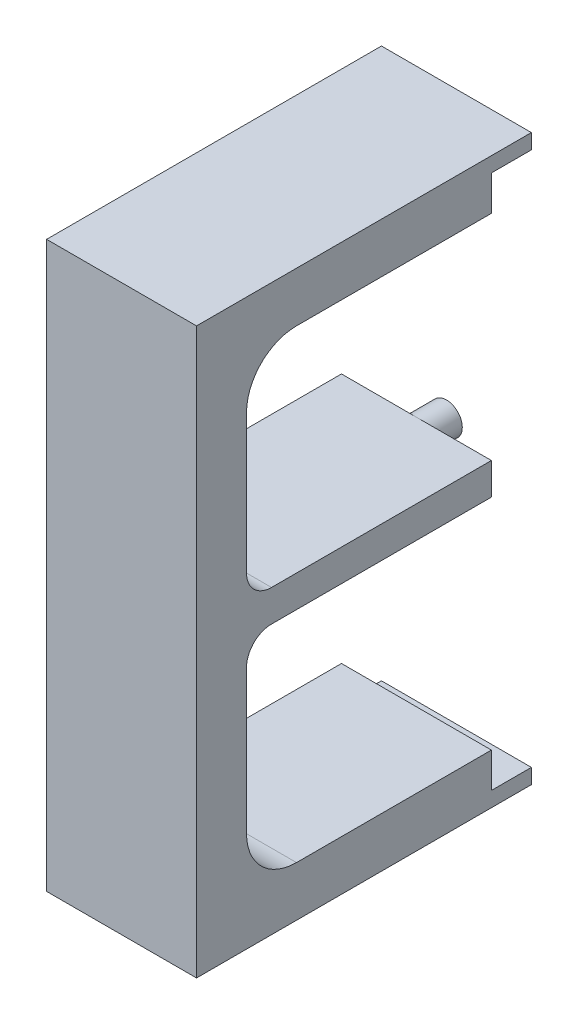
ISO-10303-21;
HEADER;
FILE_DESCRIPTION(('STEP AP214'),'2;1');
FILE_NAME('part.step','',(''),(''),'','','');
FILE_SCHEMA(('AUTOMOTIVE_DESIGN { 1 0 10303 214 1 1 1 1 }'));
ENDSEC;
DATA;
#1=APPLICATION_CONTEXT('core data for automotive mechanical design processes');
#2=APPLICATION_PROTOCOL_DEFINITION('international standard','automotive_design',2000,#1);
#3=PRODUCT_CONTEXT('',#1,'mechanical');
#4=PRODUCT('Part','Part','',(#3));
#5=PRODUCT_RELATED_PRODUCT_CATEGORY('part','',(#4));
#6=PRODUCT_DEFINITION_FORMATION('','',#4);
#7=PRODUCT_DEFINITION_CONTEXT('part definition',#1,'design');
#8=PRODUCT_DEFINITION('design','',#6,#7);
#9=PRODUCT_DEFINITION_SHAPE('','',#8);
#10=(LENGTH_UNIT() NAMED_UNIT(*) SI_UNIT(.MILLI.,.METRE.));
#11=(NAMED_UNIT(*) PLANE_ANGLE_UNIT() SI_UNIT($,.RADIAN.));
#12=(NAMED_UNIT(*) SI_UNIT($,.STERADIAN.) SOLID_ANGLE_UNIT());
#13=UNCERTAINTY_MEASURE_WITH_UNIT(LENGTH_MEASURE(1.E-05),#10,'distance_accuracy_value','');
#14=(GEOMETRIC_REPRESENTATION_CONTEXT(3) GLOBAL_UNCERTAINTY_ASSIGNED_CONTEXT((#13)) GLOBAL_UNIT_ASSIGNED_CONTEXT((#10,
#11,#12)) REPRESENTATION_CONTEXT('',''));
#15=CARTESIAN_POINT('',(0.,0.,0.));
#16=DIRECTION('',(0.,0.,1.));
#17=DIRECTION('',(1.,0.,0.));
#18=AXIS2_PLACEMENT_3D('',#15,#16,#17);
#19=CARTESIAN_POINT('',(0.,0.,-2.));
#20=DIRECTION('',(0.,0.,1.));
#21=DIRECTION('',(1.,0.,0.));
#22=AXIS2_PLACEMENT_3D('',#19,#20,#21);
#23=PLANE('',#22);
#24=DIRECTION('',(1.,0.,0.));
#25=VECTOR('',#24,1.);
#26=CARTESIAN_POINT('',(15.,-100.,-2.));
#27=LINE('',#26,#25);
#28=CARTESIAN_POINT('',(-15.,-100.,-2.));
#29=VERTEX_POINT('',#28);
#30=CARTESIAN_POINT('',(15.,-100.,-2.));
#31=VERTEX_POINT('',#30);
#32=EDGE_CURVE('E229',#29,#31,#27,.T.);
#33=ORIENTED_EDGE('',*,*,#32,.F.);
#34=DIRECTION('',(0.,-1.,0.));
#35=VECTOR('',#34,1.);
#36=CARTESIAN_POINT('',(-15.,0.,-2.));
#37=LINE('',#36,#35);
#38=CARTESIAN_POINT('',(-15.,-93.,-2.));
#39=VERTEX_POINT('',#38);
#40=EDGE_CURVE('E318',#39,#29,#37,.T.);
#41=ORIENTED_EDGE('',*,*,#40,.F.);
#42=DIRECTION('',(1.,0.,0.));
#43=VECTOR('',#42,1.);
#44=CARTESIAN_POINT('',(-15.,-93.,-2.));
#45=LINE('',#44,#43);
#46=CARTESIAN_POINT('',(15.,-93.,-2.));
#47=VERTEX_POINT('',#46);
#48=EDGE_CURVE('E279',#39,#47,#45,.T.);
#49=ORIENTED_EDGE('',*,*,#48,.T.);
#50=DIRECTION('',(0.,-1.,0.));
#51=VECTOR('',#50,1.);
#52=CARTESIAN_POINT('',(15.,0.,-2.));
#53=LINE('',#52,#51);
#54=EDGE_CURVE('E314',#47,#31,#53,.T.);
#55=ORIENTED_EDGE('',*,*,#54,.T.);
#56=EDGE_LOOP('',(#33,#41,#49,#55));
#57=FACE_BOUND('',#56,.T.);
#58=ADVANCED_FACE('F63',(#57),#23,.F.);
#59=DIRECTION('',(-1.,0.,0.));
#60=VECTOR('',#59,1.);
#61=CARTESIAN_POINT('',(15.,7.00000000000001,-2.));
#62=LINE('',#61,#60);
#63=CARTESIAN_POINT('',(15.,7.00000000000001,-2.));
#64=VERTEX_POINT('',#63);
#65=CARTESIAN_POINT('',(-15.,7.00000000000001,-2.));
#66=VERTEX_POINT('',#65);
#67=EDGE_CURVE('E239',#64,#66,#62,.T.);
#68=ORIENTED_EDGE('',*,*,#67,.F.);
#69=CARTESIAN_POINT('',(15.,0.,-2.));
#70=VERTEX_POINT('',#69);
#71=EDGE_CURVE('E315',#64,#70,#53,.T.);
#72=ORIENTED_EDGE('',*,*,#71,.T.);
#73=DIRECTION('',(1.,0.,0.));
#74=VECTOR('',#73,1.);
#75=CARTESIAN_POINT('',(-15.,0.,-2.));
#76=LINE('',#75,#74);
#77=CARTESIAN_POINT('',(-15.,0.,-2.));
#78=VERTEX_POINT('',#77);
#79=EDGE_CURVE('E270',#78,#70,#76,.T.);
#80=ORIENTED_EDGE('',*,*,#79,.F.);
#81=EDGE_CURVE('E320',#66,#78,#37,.T.);
#82=ORIENTED_EDGE('',*,*,#81,.F.);
#83=EDGE_LOOP('',(#68,#72,#80,#82));
#84=FACE_BOUND('',#83,.T.);
#85=ADVANCED_FACE('F420',(#84),#23,.F.);
#86=CARTESIAN_POINT('',(15.,0.,-2.));
#87=DIRECTION('',(-1.,0.,0.));
#88=DIRECTION('',(0.,-1.,0.));
#89=AXIS2_PLACEMENT_3D('',#86,#87,#88);
#90=PLANE('',#89);
#91=DIRECTION('',(0.,-1.,0.));
#92=VECTOR('',#91,1.);
#93=CARTESIAN_POINT('',(15.,0.,47.));
#94=LINE('',#93,#92);
#95=CARTESIAN_POINT('',(15.,-9.99999999999999,47.));
#96=VERTEX_POINT('',#95);
#97=CARTESIAN_POINT('',(15.,-37.825,47.));
#98=VERTEX_POINT('',#97);
#99=EDGE_CURVE('E297',#96,#98,#94,.T.);
#100=ORIENTED_EDGE('',*,*,#99,.F.);
#101=CARTESIAN_POINT('',(15.,-9.99999999999999,37.));
#102=DIRECTION('',(-1.,0.,0.));
#103=DIRECTION('',(0.,-1.,0.));
#104=AXIS2_PLACEMENT_3D('',#101,#102,#103);
#105=CIRCLE('',#104,10.);
#106=CARTESIAN_POINT('',(15.,0.,37.));
#107=VERTEX_POINT('',#106);
#108=EDGE_CURVE('E334',#96,#107,#105,.T.);
#109=ORIENTED_EDGE('',*,*,#108,.T.);
#110=DIRECTION('',(0.,0.,-1.));
#111=VECTOR('',#110,1.);
#112=CARTESIAN_POINT('',(15.,0.,-2.));
#113=LINE('',#112,#111);
#114=EDGE_CURVE('E293',#107,#70,#113,.T.);
#115=ORIENTED_EDGE('',*,*,#114,.T.);
#116=ORIENTED_EDGE('',*,*,#71,.F.);
#117=DIRECTION('',(0.,0.,1.));
#118=VECTOR('',#117,1.);
#119=CARTESIAN_POINT('',(15.,7.00000000000001,-10.));
#120=LINE('',#119,#118);
#121=CARTESIAN_POINT('',(15.,7.00000000000001,-10.));
#122=VERTEX_POINT('',#121);
#123=EDGE_CURVE('E256',#122,#64,#120,.T.);
#124=ORIENTED_EDGE('',*,*,#123,.F.);
#125=DIRECTION('',(0.,-1.,0.));
#126=VECTOR('',#125,1.);
#127=CARTESIAN_POINT('',(15.,10.,-10.));
#128=LINE('',#127,#126);
#129=CARTESIAN_POINT('',(15.,10.,-10.));
#130=VERTEX_POINT('',#129);
#131=EDGE_CURVE('E240',#130,#122,#128,.T.);
#132=ORIENTED_EDGE('',*,*,#131,.F.);
#133=DIRECTION('',(0.,0.,1.));
#134=VECTOR('',#133,1.);
#135=CARTESIAN_POINT('',(15.,10.,-2.));
#136=LINE('',#135,#134);
#137=CARTESIAN_POINT('',(15.,10.,57.));
#138=VERTEX_POINT('',#137);
#139=EDGE_CURVE('E321',#130,#138,#136,.T.);
#140=ORIENTED_EDGE('',*,*,#139,.T.);
#141=DIRECTION('',(0.,-1.,0.));
#142=VECTOR('',#141,1.);
#143=CARTESIAN_POINT('',(15.,0.,57.));
#144=LINE('',#143,#142);
#145=CARTESIAN_POINT('',(15.,-103.,57.));
#146=VERTEX_POINT('',#145);
#147=EDGE_CURVE('E211',#138,#146,#144,.T.);
#148=ORIENTED_EDGE('',*,*,#147,.T.);
#149=DIRECTION('',(0.,0.,1.));
#150=VECTOR('',#149,1.);
#151=CARTESIAN_POINT('',(15.,-103.,-2.));
#152=LINE('',#151,#150);
#153=CARTESIAN_POINT('',(15.,-103.,-10.));
#154=VERTEX_POINT('',#153);
#155=EDGE_CURVE('E203',#154,#146,#152,.T.);
#156=ORIENTED_EDGE('',*,*,#155,.F.);
#157=DIRECTION('',(0.,-1.,0.));
#158=VECTOR('',#157,1.);
#159=CARTESIAN_POINT('',(15.,-103.,-10.));
#160=LINE('',#159,#158);
#161=CARTESIAN_POINT('',(15.,-100.,-10.));
#162=VERTEX_POINT('',#161);
#163=EDGE_CURVE('E209',#162,#154,#160,.T.);
#164=ORIENTED_EDGE('',*,*,#163,.F.);
#165=DIRECTION('',(0.,0.,1.));
#166=VECTOR('',#165,1.);
#167=CARTESIAN_POINT('',(15.,-100.,-10.));
#168=LINE('',#167,#166);
#169=EDGE_CURVE('E234',#162,#31,#168,.T.);
#170=ORIENTED_EDGE('',*,*,#169,.T.);
#171=ORIENTED_EDGE('',*,*,#54,.F.);
#172=DIRECTION('',(0.,0.,-1.));
#173=VECTOR('',#172,1.);
#174=CARTESIAN_POINT('',(15.,-93.,-2.));
#175=LINE('',#174,#173);
#176=CARTESIAN_POINT('',(15.,-93.,37.));
#177=VERTEX_POINT('',#176);
#178=EDGE_CURVE('E289',#177,#47,#175,.T.);
#179=ORIENTED_EDGE('',*,*,#178,.F.);
#180=CARTESIAN_POINT('',(15.,-83.,37.));
#181=DIRECTION('',(-1.,0.,0.));
#182=DIRECTION('',(0.,-1.,0.));
#183=AXIS2_PLACEMENT_3D('',#180,#181,#182);
#184=CIRCLE('',#183,10.);
#185=CARTESIAN_POINT('',(15.,-83.,47.));
#186=VERTEX_POINT('',#185);
#187=EDGE_CURVE('E345',#177,#186,#184,.T.);
#188=ORIENTED_EDGE('',*,*,#187,.T.);
#189=DIRECTION('',(0.,1.,0.));
#190=VECTOR('',#189,1.);
#191=CARTESIAN_POINT('',(15.,0.,47.));
#192=LINE('',#191,#190);
#193=CARTESIAN_POINT('',(15.,-54.175,47.));
#194=VERTEX_POINT('',#193);
#195=EDGE_CURVE('E295',#186,#194,#192,.T.);
#196=ORIENTED_EDGE('',*,*,#195,.T.);
#197=CARTESIAN_POINT('',(15.,-54.175,42.));
#198=DIRECTION('',(-1.,0.,0.));
#199=DIRECTION('',(0.,-1.,0.));
#200=AXIS2_PLACEMENT_3D('',#197,#198,#199);
#201=CIRCLE('',#200,5.);
#202=CARTESIAN_POINT('',(15.,-49.175,42.));
#203=VERTEX_POINT('',#202);
#204=EDGE_CURVE('E71',#194,#203,#201,.T.);
#205=ORIENTED_EDGE('',*,*,#204,.T.);
#206=DIRECTION('',(0.,0.,-1.));
#207=VECTOR('',#206,1.);
#208=CARTESIAN_POINT('',(15.,-49.175,-2.));
#209=LINE('',#208,#207);
#210=CARTESIAN_POINT('',(15.,-49.175,-2.));
#211=VERTEX_POINT('',#210);
#212=EDGE_CURVE('E273',#203,#211,#209,.T.);
#213=ORIENTED_EDGE('',*,*,#212,.T.);
#214=CARTESIAN_POINT('',(15.,-42.825,-2.));
#215=VERTEX_POINT('',#214);
#216=EDGE_CURVE('E319',#215,#211,#53,.T.);
#217=ORIENTED_EDGE('',*,*,#216,.F.);
#218=DIRECTION('',(0.,0.,-1.));
#219=VECTOR('',#218,1.);
#220=CARTESIAN_POINT('',(15.,-42.825,-2.));
#221=LINE('',#220,#219);
#222=CARTESIAN_POINT('',(15.,-42.825,42.));
#223=VERTEX_POINT('',#222);
#224=EDGE_CURVE('E291',#223,#215,#221,.T.);
#225=ORIENTED_EDGE('',*,*,#224,.F.);
#226=CARTESIAN_POINT('',(15.,-37.825,42.));
#227=DIRECTION('',(-1.,0.,0.));
#228=DIRECTION('',(0.,-1.,0.));
#229=AXIS2_PLACEMENT_3D('',#226,#227,#228);
#230=CIRCLE('',#229,5.);
#231=EDGE_CURVE('E354',#223,#98,#230,.T.);
#232=ORIENTED_EDGE('',*,*,#231,.T.);
#233=EDGE_LOOP('',(#100,#109,#115,#116,#124,#132,#140,#148,#156,#164,#170,#171,#179,#188,#196,
#205,#213,#217,#225,#232));
#234=FACE_BOUND('',#233,.T.);
#235=ADVANCED_FACE('F206',(#234),#90,.F.);
#236=CARTESIAN_POINT('',(-15.,0.,-2.));
#237=DIRECTION('',(-1.,0.,0.));
#238=DIRECTION('',(0.,-1.,0.));
#239=AXIS2_PLACEMENT_3D('',#236,#237,#238);
#240=PLANE('',#239);
#241=DIRECTION('',(0.,0.,1.));
#242=VECTOR('',#241,1.);
#243=CARTESIAN_POINT('',(-15.,0.,-2.));
#244=LINE('',#243,#242);
#245=CARTESIAN_POINT('',(-15.,0.,37.));
#246=VERTEX_POINT('',#245);
#247=EDGE_CURVE('E260',#78,#246,#244,.T.);
#248=ORIENTED_EDGE('',*,*,#247,.T.);
#249=CARTESIAN_POINT('',(-15.,-10.,37.));
#250=DIRECTION('',(-1.,0.,0.));
#251=DIRECTION('',(0.,-1.,0.));
#252=AXIS2_PLACEMENT_3D('',#249,#250,#251);
#253=CIRCLE('',#252,10.);
#254=CARTESIAN_POINT('',(-15.,-10.,47.));
#255=VERTEX_POINT('',#254);
#256=EDGE_CURVE('E336',#246,#255,#253,.F.);
#257=ORIENTED_EDGE('',*,*,#256,.T.);
#258=DIRECTION('',(0.,1.,0.));
#259=VECTOR('',#258,1.);
#260=CARTESIAN_POINT('',(-15.,-42.825,47.));
#261=LINE('',#260,#259);
#262=CARTESIAN_POINT('',(-15.,-37.825,47.));
#263=VERTEX_POINT('',#262);
#264=EDGE_CURVE('E263',#263,#255,#261,.T.);
#265=ORIENTED_EDGE('',*,*,#264,.F.);
#266=CARTESIAN_POINT('',(-15.,-37.825,42.));
#267=DIRECTION('',(-1.,0.,0.));
#268=DIRECTION('',(0.,-1.,0.));
#269=AXIS2_PLACEMENT_3D('',#266,#267,#268);
#270=CIRCLE('',#269,5.);
#271=CARTESIAN_POINT('',(-15.,-42.825,42.));
#272=VERTEX_POINT('',#271);
#273=EDGE_CURVE('E356',#263,#272,#270,.F.);
#274=ORIENTED_EDGE('',*,*,#273,.T.);
#275=DIRECTION('',(0.,0.,1.));
#276=VECTOR('',#275,1.);
#277=CARTESIAN_POINT('',(-15.,-42.825,-2.));
#278=LINE('',#277,#276);
#279=CARTESIAN_POINT('',(-15.,-42.825,-2.));
#280=VERTEX_POINT('',#279);
#281=EDGE_CURVE('E266',#280,#272,#278,.T.);
#282=ORIENTED_EDGE('',*,*,#281,.F.);
#283=CARTESIAN_POINT('',(-15.,-49.175,-2.));
#284=VERTEX_POINT('',#283);
#285=EDGE_CURVE('E322',#280,#284,#37,.T.);
#286=ORIENTED_EDGE('',*,*,#285,.T.);
#287=DIRECTION('',(0.,0.,1.));
#288=VECTOR('',#287,1.);
#289=CARTESIAN_POINT('',(-15.,-49.175,-2.));
#290=LINE('',#289,#288);
#291=CARTESIAN_POINT('',(-15.,-49.175,42.));
#292=VERTEX_POINT('',#291);
#293=EDGE_CURVE('E282',#284,#292,#290,.T.);
#294=ORIENTED_EDGE('',*,*,#293,.T.);
#295=CARTESIAN_POINT('',(-15.,-54.175,42.));
#296=DIRECTION('',(-1.,0.,0.));
#297=DIRECTION('',(0.,-1.,0.));
#298=AXIS2_PLACEMENT_3D('',#295,#296,#297);
#299=CIRCLE('',#298,5.);
#300=CARTESIAN_POINT('',(-15.,-54.175,47.));
#301=VERTEX_POINT('',#300);
#302=EDGE_CURVE('E12',#292,#301,#299,.F.);
#303=ORIENTED_EDGE('',*,*,#302,.T.);
#304=DIRECTION('',(0.,-1.,0.));
#305=VECTOR('',#304,1.);
#306=CARTESIAN_POINT('',(-15.,-49.175,47.));
#307=LINE('',#306,#305);
#308=CARTESIAN_POINT('',(-15.,-83.,47.));
#309=VERTEX_POINT('',#308);
#310=EDGE_CURVE('E284',#301,#309,#307,.T.);
#311=ORIENTED_EDGE('',*,*,#310,.T.);
#312=CARTESIAN_POINT('',(-15.,-83.,37.));
#313=DIRECTION('',(-1.,0.,0.));
#314=DIRECTION('',(0.,-1.,0.));
#315=AXIS2_PLACEMENT_3D('',#312,#313,#314);
#316=CIRCLE('',#315,10.);
#317=CARTESIAN_POINT('',(-15.,-93.,37.));
#318=VERTEX_POINT('',#317);
#319=EDGE_CURVE('E347',#309,#318,#316,.F.);
#320=ORIENTED_EDGE('',*,*,#319,.T.);
#321=DIRECTION('',(0.,0.,1.));
#322=VECTOR('',#321,1.);
#323=CARTESIAN_POINT('',(-15.,-93.,-2.));
#324=LINE('',#323,#322);
#325=EDGE_CURVE('E264',#39,#318,#324,.T.);
#326=ORIENTED_EDGE('',*,*,#325,.F.);
#327=ORIENTED_EDGE('',*,*,#40,.T.);
#328=DIRECTION('',(0.,0.,1.));
#329=VECTOR('',#328,1.);
#330=CARTESIAN_POINT('',(-15.,-100.,-10.));
#331=LINE('',#330,#329);
#332=CARTESIAN_POINT('',(-15.,-100.,-10.));
#333=VERTEX_POINT('',#332);
#334=EDGE_CURVE('E237',#333,#29,#331,.T.);
#335=ORIENTED_EDGE('',*,*,#334,.F.);
#336=DIRECTION('',(0.,1.,0.));
#337=VECTOR('',#336,1.);
#338=CARTESIAN_POINT('',(-15.,-103.,-10.));
#339=LINE('',#338,#337);
#340=CARTESIAN_POINT('',(-15.,-103.,-10.));
#341=VERTEX_POINT('',#340);
#342=EDGE_CURVE('E223',#341,#333,#339,.T.);
#343=ORIENTED_EDGE('',*,*,#342,.F.);
#344=DIRECTION('',(0.,0.,1.));
#345=VECTOR('',#344,1.);
#346=CARTESIAN_POINT('',(-15.,-103.,-2.));
#347=LINE('',#346,#345);
#348=CARTESIAN_POINT('',(-15.,-103.,57.));
#349=VERTEX_POINT('',#348);
#350=EDGE_CURVE('E216',#341,#349,#347,.T.);
#351=ORIENTED_EDGE('',*,*,#350,.T.);
#352=DIRECTION('',(0.,-1.,0.));
#353=VECTOR('',#352,1.);
#354=CARTESIAN_POINT('',(-15.,0.,57.));
#355=LINE('',#354,#353);
#356=CARTESIAN_POINT('',(-15.,10.,57.));
#357=VERTEX_POINT('',#356);
#358=EDGE_CURVE('E309',#357,#349,#355,.T.);
#359=ORIENTED_EDGE('',*,*,#358,.F.);
#360=DIRECTION('',(0.,0.,1.));
#361=VECTOR('',#360,1.);
#362=CARTESIAN_POINT('',(-15.,10.,-2.));
#363=LINE('',#362,#361);
#364=CARTESIAN_POINT('',(-15.,10.,-10.));
#365=VERTEX_POINT('',#364);
#366=EDGE_CURVE('E325',#365,#357,#363,.T.);
#367=ORIENTED_EDGE('',*,*,#366,.F.);
#368=DIRECTION('',(0.,1.,0.));
#369=VECTOR('',#368,1.);
#370=CARTESIAN_POINT('',(-15.,10.,-10.));
#371=LINE('',#370,#369);
#372=CARTESIAN_POINT('',(-15.,7.00000000000001,-10.));
#373=VERTEX_POINT('',#372);
#374=EDGE_CURVE('E245',#373,#365,#371,.T.);
#375=ORIENTED_EDGE('',*,*,#374,.F.);
#376=DIRECTION('',(0.,0.,1.));
#377=VECTOR('',#376,1.);
#378=CARTESIAN_POINT('',(-15.,7.00000000000001,-10.));
#379=LINE('',#378,#377);
#380=EDGE_CURVE('E251',#373,#66,#379,.T.);
#381=ORIENTED_EDGE('',*,*,#380,.T.);
#382=ORIENTED_EDGE('',*,*,#81,.T.);
#383=EDGE_LOOP('',(#248,#257,#265,#274,#282,#286,#294,#303,#311,#320,#326,#327,#335,#343,#351,
#359,#367,#375,#381,#382));
#384=FACE_BOUND('',#383,.T.);
#385=ADVANCED_FACE('F381',(#384),#240,.T.);
#386=DIRECTION('',(1.,0.,0.));
#387=VECTOR('',#386,1.);
#388=CARTESIAN_POINT('',(-15.,-42.825,-2.));
#389=LINE('',#388,#387);
#390=CARTESIAN_POINT('',(0.,-42.825,-2.));
#391=VERTEX_POINT('',#390);
#392=EDGE_CURVE('E269',#391,#215,#389,.T.);
#393=ORIENTED_EDGE('',*,*,#392,.T.);
#394=ORIENTED_EDGE('',*,*,#216,.T.);
#395=DIRECTION('',(1.,0.,0.));
#396=VECTOR('',#395,1.);
#397=CARTESIAN_POINT('',(-15.,-49.175,-2.));
#398=LINE('',#397,#396);
#399=CARTESIAN_POINT('',(0.,-49.175,-2.));
#400=VERTEX_POINT('',#399);
#401=EDGE_CURVE('E259',#400,#211,#398,.T.);
#402=ORIENTED_EDGE('',*,*,#401,.F.);
#403=CARTESIAN_POINT('',(0.,-46.,-2.));
#404=DIRECTION('',(0.,0.,1.));
#405=DIRECTION('',(1.,0.,0.));
#406=AXIS2_PLACEMENT_3D('',#403,#404,#405);
#407=CIRCLE('',#406,3.175);
#408=EDGE_CURVE('E303',#400,#391,#407,.T.);
#409=ORIENTED_EDGE('',*,*,#408,.T.);
#410=EDGE_LOOP('',(#393,#394,#402,#409));
#411=FACE_BOUND('',#410,.T.);
#412=ADVANCED_FACE('F401',(#411),#23,.F.);
#413=EDGE_CURVE('E274',#280,#391,#389,.T.);
#414=ORIENTED_EDGE('',*,*,#413,.T.);
#415=EDGE_CURVE('E306',#391,#400,#407,.T.);
#416=ORIENTED_EDGE('',*,*,#415,.T.);
#417=EDGE_CURVE('E277',#284,#400,#398,.T.);
#418=ORIENTED_EDGE('',*,*,#417,.F.);
#419=ORIENTED_EDGE('',*,*,#285,.F.);
#420=EDGE_LOOP('',(#414,#416,#418,#419));
#421=FACE_BOUND('',#420,.T.);
#422=ADVANCED_FACE('F391',(#421),#23,.F.);
#423=CARTESIAN_POINT('',(0.,0.,57.));
#424=DIRECTION('',(0.,0.,1.));
#425=DIRECTION('',(1.,0.,0.));
#426=AXIS2_PLACEMENT_3D('',#423,#424,#425);
#427=PLANE('',#426);
#428=ORIENTED_EDGE('',*,*,#147,.F.);
#429=DIRECTION('',(1.,0.,0.));
#430=VECTOR('',#429,1.);
#431=CARTESIAN_POINT('',(0.,10.,57.));
#432=LINE('',#431,#430);
#433=EDGE_CURVE('E305',#357,#138,#432,.T.);
#434=ORIENTED_EDGE('',*,*,#433,.F.);
#435=ORIENTED_EDGE('',*,*,#358,.T.);
#436=DIRECTION('',(1.,0.,0.));
#437=VECTOR('',#436,1.);
#438=CARTESIAN_POINT('',(0.,-103.,57.));
#439=LINE('',#438,#437);
#440=EDGE_CURVE('E312',#349,#146,#439,.T.);
#441=ORIENTED_EDGE('',*,*,#440,.T.);
#442=EDGE_LOOP('',(#428,#434,#435,#441));
#443=FACE_BOUND('',#442,.T.);
#444=ADVANCED_FACE('F432',(#443),#427,.T.);
#445=CARTESIAN_POINT('',(0.,-103.,-2.));
#446=DIRECTION('',(0.,-1.,0.));
#447=DIRECTION('',(0.,0.,-1.));
#448=AXIS2_PLACEMENT_3D('',#445,#446,#447);
#449=PLANE('',#448);
#450=ORIENTED_EDGE('',*,*,#155,.T.);
#451=ORIENTED_EDGE('',*,*,#440,.F.);
#452=ORIENTED_EDGE('',*,*,#350,.F.);
#453=DIRECTION('',(-1.,0.,0.));
#454=VECTOR('',#453,1.);
#455=CARTESIAN_POINT('',(15.,-103.,-10.));
#456=LINE('',#455,#454);
#457=EDGE_CURVE('E219',#154,#341,#456,.T.);
#458=ORIENTED_EDGE('',*,*,#457,.F.);
#459=EDGE_LOOP('',(#450,#451,#452,#458));
#460=FACE_BOUND('',#459,.T.);
#461=ADVANCED_FACE('F220',(#460),#449,.T.);
#462=CARTESIAN_POINT('',(0.,10.,-2.));
#463=DIRECTION('',(0.,-1.,0.));
#464=DIRECTION('',(1.,0.,0.));
#465=AXIS2_PLACEMENT_3D('',#462,#463,#464);
#466=PLANE('',#465);
#467=ORIENTED_EDGE('',*,*,#366,.T.);
#468=ORIENTED_EDGE('',*,*,#433,.T.);
#469=ORIENTED_EDGE('',*,*,#139,.F.);
#470=DIRECTION('',(1.,0.,0.));
#471=VECTOR('',#470,1.);
#472=CARTESIAN_POINT('',(15.,10.,-10.));
#473=LINE('',#472,#471);
#474=EDGE_CURVE('E248',#365,#130,#473,.T.);
#475=ORIENTED_EDGE('',*,*,#474,.F.);
#476=EDGE_LOOP('',(#467,#468,#469,#475));
#477=FACE_BOUND('',#476,.T.);
#478=ADVANCED_FACE('F407',(#477),#466,.F.);
#479=CARTESIAN_POINT('',(0.,-46.,-8.));
#480=DIRECTION('',(0.,0.,1.));
#481=DIRECTION('',(1.,0.,0.));
#482=AXIS2_PLACEMENT_3D('',#479,#480,#481);
#483=CYLINDRICAL_SURFACE('',#482,3.175);
#484=CARTESIAN_POINT('',(0.,-46.,-8.));
#485=DIRECTION('',(0.,0.,1.));
#486=DIRECTION('',(1.,0.,0.));
#487=AXIS2_PLACEMENT_3D('',#484,#485,#486);
#488=CIRCLE('',#487,3.175);
#489=CARTESIAN_POINT('',(3.175,-46.,-8.));
#490=VERTEX_POINT('',#489);
#491=EDGE_CURVE('E300',#490,#490,#488,.T.);
#492=ORIENTED_EDGE('',*,*,#491,.T.);
#493=EDGE_LOOP('',(#492));
#494=FACE_BOUND('',#493,.T.);
#495=ORIENTED_EDGE('',*,*,#415,.F.);
#496=ORIENTED_EDGE('',*,*,#408,.F.);
#497=EDGE_LOOP('',(#495,#496));
#498=FACE_BOUND('',#497,.T.);
#499=ADVANCED_FACE('F404',(#494,#498),#483,.T.);
#500=CARTESIAN_POINT('',(0.,-46.,-8.));
#501=DIRECTION('',(0.,0.,1.));
#502=DIRECTION('',(1.,0.,0.));
#503=AXIS2_PLACEMENT_3D('',#500,#501,#502);
#504=PLANE('',#503);
#505=ORIENTED_EDGE('',*,*,#491,.F.);
#506=EDGE_LOOP('',(#505));
#507=FACE_BOUND('',#506,.T.);
#508=ADVANCED_FACE('F406',(#507),#504,.F.);
#509=CARTESIAN_POINT('',(-15.,-49.175,47.));
#510=DIRECTION('',(0.,0.,1.));
#511=DIRECTION('',(0.,-1.,0.));
#512=AXIS2_PLACEMENT_3D('',#509,#510,#511);
#513=PLANE('',#512);
#514=ORIENTED_EDGE('',*,*,#310,.F.);
#515=DIRECTION('',(1.,0.,0.));
#516=VECTOR('',#515,1.);
#517=CARTESIAN_POINT('',(15.,-54.175,47.));
#518=LINE('',#517,#516);
#519=EDGE_CURVE('E358',#301,#194,#518,.T.);
#520=ORIENTED_EDGE('',*,*,#519,.T.);
#521=ORIENTED_EDGE('',*,*,#195,.F.);
#522=DIRECTION('',(1.,0.,0.));
#523=VECTOR('',#522,1.);
#524=CARTESIAN_POINT('',(-15.,-83.,47.));
#525=LINE('',#524,#523);
#526=EDGE_CURVE('E342',#186,#309,#525,.F.);
#527=ORIENTED_EDGE('',*,*,#526,.T.);
#528=EDGE_LOOP('',(#514,#520,#521,#527));
#529=FACE_BOUND('',#528,.T.);
#530=ADVANCED_FACE('F365',(#529),#513,.F.);
#531=CARTESIAN_POINT('',(-15.,-93.,-2.));
#532=DIRECTION('',(0.,1.,0.));
#533=DIRECTION('',(-1.,0.,0.));
#534=AXIS2_PLACEMENT_3D('',#531,#532,#533);
#535=PLANE('',#534);
#536=ORIENTED_EDGE('',*,*,#325,.T.);
#537=DIRECTION('',(1.,0.,0.));
#538=VECTOR('',#537,1.);
#539=CARTESIAN_POINT('',(-15.,-93.,37.));
#540=LINE('',#539,#538);
#541=EDGE_CURVE('E339',#318,#177,#540,.T.);
#542=ORIENTED_EDGE('',*,*,#541,.T.);
#543=ORIENTED_EDGE('',*,*,#178,.T.);
#544=ORIENTED_EDGE('',*,*,#48,.F.);
#545=EDGE_LOOP('',(#536,#542,#543,#544));
#546=FACE_BOUND('',#545,.T.);
#547=ADVANCED_FACE('F376',(#546),#535,.T.);
#548=CARTESIAN_POINT('',(-15.,-49.175,-2.));
#549=DIRECTION('',(0.,1.,0.));
#550=DIRECTION('',(-1.,0.,0.));
#551=AXIS2_PLACEMENT_3D('',#548,#549,#550);
#552=PLANE('',#551);
#553=ORIENTED_EDGE('',*,*,#212,.F.);
#554=DIRECTION('',(1.,0.,0.));
#555=VECTOR('',#554,1.);
#556=CARTESIAN_POINT('',(-15.,-49.175,42.));
#557=LINE('',#556,#555);
#558=EDGE_CURVE('E84',#203,#292,#557,.F.);
#559=ORIENTED_EDGE('',*,*,#558,.T.);
#560=ORIENTED_EDGE('',*,*,#293,.F.);
#561=ORIENTED_EDGE('',*,*,#417,.T.);
#562=ORIENTED_EDGE('',*,*,#401,.T.);
#563=EDGE_LOOP('',(#553,#559,#560,#561,#562));
#564=FACE_BOUND('',#563,.T.);
#565=ADVANCED_FACE('F396',(#564),#552,.F.);
#566=CARTESIAN_POINT('',(-15.,-42.825,47.));
#567=DIRECTION('',(0.,0.,-1.));
#568=DIRECTION('',(-1.,0.,0.));
#569=AXIS2_PLACEMENT_3D('',#566,#567,#568);
#570=PLANE('',#569);
#571=ORIENTED_EDGE('',*,*,#99,.T.);
#572=DIRECTION('',(1.,0.,0.));
#573=VECTOR('',#572,1.);
#574=CARTESIAN_POINT('',(-15.,-37.825,47.));
#575=LINE('',#574,#573);
#576=EDGE_CURVE('E352',#98,#263,#575,.F.);
#577=ORIENTED_EDGE('',*,*,#576,.T.);
#578=ORIENTED_EDGE('',*,*,#264,.T.);
#579=DIRECTION('',(1.,0.,0.));
#580=VECTOR('',#579,1.);
#581=CARTESIAN_POINT('',(-15.,-10.,47.));
#582=LINE('',#581,#580);
#583=EDGE_CURVE('E215',#255,#96,#582,.T.);
#584=ORIENTED_EDGE('',*,*,#583,.T.);
#585=EDGE_LOOP('',(#571,#577,#578,#584));
#586=FACE_BOUND('',#585,.T.);
#587=ADVANCED_FACE('F481',(#586),#570,.T.);
#588=CARTESIAN_POINT('',(-15.,0.,-2.));
#589=DIRECTION('',(0.,1.,0.));
#590=DIRECTION('',(-1.,0.,0.));
#591=AXIS2_PLACEMENT_3D('',#588,#589,#590);
#592=PLANE('',#591);
#593=ORIENTED_EDGE('',*,*,#114,.F.);
#594=DIRECTION('',(1.,0.,0.));
#595=VECTOR('',#594,1.);
#596=CARTESIAN_POINT('',(-15.,0.,37.));
#597=LINE('',#596,#595);
#598=EDGE_CURVE('E332',#107,#246,#597,.F.);
#599=ORIENTED_EDGE('',*,*,#598,.T.);
#600=ORIENTED_EDGE('',*,*,#247,.F.);
#601=ORIENTED_EDGE('',*,*,#79,.T.);
#602=EDGE_LOOP('',(#593,#599,#600,#601));
#603=FACE_BOUND('',#602,.T.);
#604=ADVANCED_FACE('F476',(#603),#592,.F.);
#605=CARTESIAN_POINT('',(-15.,-42.825,-2.));
#606=DIRECTION('',(0.,1.,0.));
#607=DIRECTION('',(-1.,0.,0.));
#608=AXIS2_PLACEMENT_3D('',#605,#606,#607);
#609=PLANE('',#608);
#610=ORIENTED_EDGE('',*,*,#281,.T.);
#611=DIRECTION('',(1.,0.,0.));
#612=VECTOR('',#611,1.);
#613=CARTESIAN_POINT('',(15.,-42.825,42.));
#614=LINE('',#613,#612);
#615=EDGE_CURVE('E349',#272,#223,#614,.T.);
#616=ORIENTED_EDGE('',*,*,#615,.T.);
#617=ORIENTED_EDGE('',*,*,#224,.T.);
#618=ORIENTED_EDGE('',*,*,#392,.F.);
#619=ORIENTED_EDGE('',*,*,#413,.F.);
#620=EDGE_LOOP('',(#610,#616,#617,#618,#619));
#621=FACE_BOUND('',#620,.T.);
#622=ADVANCED_FACE('F455',(#621),#609,.T.);
#623=CARTESIAN_POINT('',(15.,7.00000000000001,-10.));
#624=DIRECTION('',(0.,1.,0.));
#625=DIRECTION('',(0.,0.,1.));
#626=AXIS2_PLACEMENT_3D('',#623,#624,#625);
#627=PLANE('',#626);
#628=ORIENTED_EDGE('',*,*,#67,.T.);
#629=ORIENTED_EDGE('',*,*,#380,.F.);
#630=DIRECTION('',(-1.,0.,0.));
#631=VECTOR('',#630,1.);
#632=CARTESIAN_POINT('',(15.,7.00000000000001,-10.));
#633=LINE('',#632,#631);
#634=EDGE_CURVE('E243',#122,#373,#633,.T.);
#635=ORIENTED_EDGE('',*,*,#634,.F.);
#636=ORIENTED_EDGE('',*,*,#123,.T.);
#637=EDGE_LOOP('',(#628,#629,#635,#636));
#638=FACE_BOUND('',#637,.T.);
#639=ADVANCED_FACE('F470',(#638),#627,.F.);
#640=CARTESIAN_POINT('',(0.,0.,-10.));
#641=DIRECTION('',(0.,0.,-1.));
#642=DIRECTION('',(-1.,0.,0.));
#643=AXIS2_PLACEMENT_3D('',#640,#641,#642);
#644=PLANE('',#643);
#645=ORIENTED_EDGE('',*,*,#131,.T.);
#646=ORIENTED_EDGE('',*,*,#634,.T.);
#647=ORIENTED_EDGE('',*,*,#374,.T.);
#648=ORIENTED_EDGE('',*,*,#474,.T.);
#649=EDGE_LOOP('',(#645,#646,#647,#648));
#650=FACE_BOUND('',#649,.T.);
#651=ADVANCED_FACE('F465',(#650),#644,.T.);
#652=CARTESIAN_POINT('',(15.,-100.,-10.));
#653=DIRECTION('',(0.,-1.,0.));
#654=DIRECTION('',(0.,0.,-1.));
#655=AXIS2_PLACEMENT_3D('',#652,#653,#654);
#656=PLANE('',#655);
#657=ORIENTED_EDGE('',*,*,#32,.T.);
#658=ORIENTED_EDGE('',*,*,#169,.F.);
#659=DIRECTION('',(1.,0.,0.));
#660=VECTOR('',#659,1.);
#661=CARTESIAN_POINT('',(15.,-100.,-10.));
#662=LINE('',#661,#660);
#663=EDGE_CURVE('E227',#333,#162,#662,.T.);
#664=ORIENTED_EDGE('',*,*,#663,.F.);
#665=ORIENTED_EDGE('',*,*,#334,.T.);
#666=EDGE_LOOP('',(#657,#658,#664,#665));
#667=FACE_BOUND('',#666,.T.);
#668=ADVANCED_FACE('F458',(#667),#656,.F.);
#669=CARTESIAN_POINT('',(0.,0.,-10.));
#670=DIRECTION('',(0.,0.,1.));
#671=DIRECTION('',(1.,0.,0.));
#672=AXIS2_PLACEMENT_3D('',#669,#670,#671);
#673=PLANE('',#672);
#674=ORIENTED_EDGE('',*,*,#163,.T.);
#675=ORIENTED_EDGE('',*,*,#457,.T.);
#676=ORIENTED_EDGE('',*,*,#342,.T.);
#677=ORIENTED_EDGE('',*,*,#663,.T.);
#678=EDGE_LOOP('',(#674,#675,#676,#677));
#679=FACE_BOUND('',#678,.T.);
#680=ADVANCED_FACE('F225',(#679),#673,.F.);
#681=CARTESIAN_POINT('',(-15.,-10.,37.));
#682=DIRECTION('',(1.,0.,0.));
#683=DIRECTION('',(0.,1.,0.));
#684=AXIS2_PLACEMENT_3D('',#681,#682,#683);
#685=CYLINDRICAL_SURFACE('',#684,10.);
#686=ORIENTED_EDGE('',*,*,#256,.F.);
#687=ORIENTED_EDGE('',*,*,#598,.F.);
#688=ORIENTED_EDGE('',*,*,#108,.F.);
#689=ORIENTED_EDGE('',*,*,#583,.F.);
#690=EDGE_LOOP('',(#686,#687,#688,#689));
#691=FACE_BOUND('',#690,.T.);
#692=ADVANCED_FACE('F439',(#691),#685,.F.);
#693=CARTESIAN_POINT('',(-15.,-83.,37.));
#694=DIRECTION('',(1.,0.,0.));
#695=DIRECTION('',(0.,1.,0.));
#696=AXIS2_PLACEMENT_3D('',#693,#694,#695);
#697=CYLINDRICAL_SURFACE('',#696,10.);
#698=ORIENTED_EDGE('',*,*,#319,.F.);
#699=ORIENTED_EDGE('',*,*,#526,.F.);
#700=ORIENTED_EDGE('',*,*,#187,.F.);
#701=ORIENTED_EDGE('',*,*,#541,.F.);
#702=EDGE_LOOP('',(#698,#699,#700,#701));
#703=FACE_BOUND('',#702,.T.);
#704=ADVANCED_FACE('F374',(#703),#697,.F.);
#705=CARTESIAN_POINT('',(-15.,-37.825,42.));
#706=DIRECTION('',(-1.,0.,0.));
#707=DIRECTION('',(0.,-1.,0.));
#708=AXIS2_PLACEMENT_3D('',#705,#706,#707);
#709=CYLINDRICAL_SURFACE('',#708,5.);
#710=ORIENTED_EDGE('',*,*,#273,.F.);
#711=ORIENTED_EDGE('',*,*,#576,.F.);
#712=ORIENTED_EDGE('',*,*,#231,.F.);
#713=ORIENTED_EDGE('',*,*,#615,.F.);
#714=EDGE_LOOP('',(#710,#711,#712,#713));
#715=FACE_BOUND('',#714,.T.);
#716=ADVANCED_FACE('F444',(#715),#709,.F.);
#717=CARTESIAN_POINT('',(-15.,-54.175,42.));
#718=DIRECTION('',(-1.,0.,0.));
#719=DIRECTION('',(0.,-1.,0.));
#720=AXIS2_PLACEMENT_3D('',#717,#718,#719);
#721=CYLINDRICAL_SURFACE('',#720,5.);
#722=ORIENTED_EDGE('',*,*,#302,.F.);
#723=ORIENTED_EDGE('',*,*,#558,.F.);
#724=ORIENTED_EDGE('',*,*,#204,.F.);
#725=ORIENTED_EDGE('',*,*,#519,.F.);
#726=EDGE_LOOP('',(#722,#723,#724,#725));
#727=FACE_BOUND('',#726,.T.);
#728=ADVANCED_FACE('F65',(#727),#721,.F.);
#729=CLOSED_SHELL('',(#58,#85,#235,#385,#412,#422,#444,#461,#478,#499,#508,#530,#547,#565,#587,
#604,#622,#639,#651,#668,#680,#692,#704,#716,#728));
#730=MANIFOLD_SOLID_BREP('B2',#729);
#731=ADVANCED_BREP_SHAPE_REPRESENTATION('',(#18,#730),#14);
#732=SHAPE_DEFINITION_REPRESENTATION(#9,#731);
ENDSEC;
END-ISO-10303-21;
